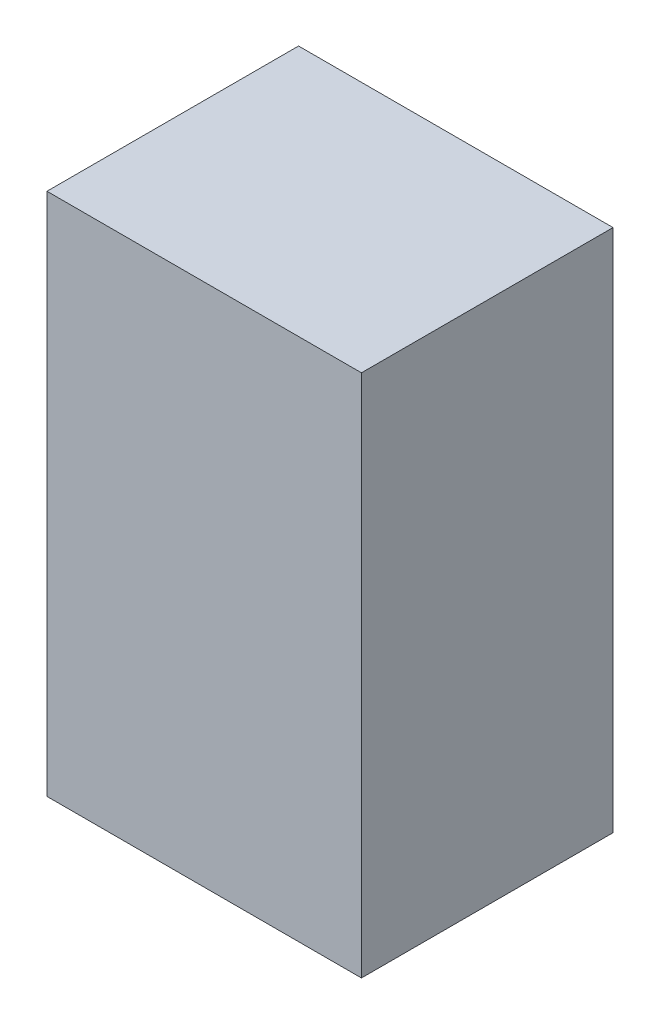
ISO-10303-21;
HEADER;
FILE_DESCRIPTION(('STEP AP214'),'2;1');
FILE_NAME('part.step','',(''),(''),'','','');
FILE_SCHEMA(('AUTOMOTIVE_DESIGN { 1 0 10303 214 1 1 1 1 }'));
ENDSEC;
DATA;
#1=APPLICATION_CONTEXT('core data for automotive mechanical design processes');
#2=APPLICATION_PROTOCOL_DEFINITION('international standard','automotive_design',2000,#1);
#3=PRODUCT_CONTEXT('',#1,'mechanical');
#4=PRODUCT('Part','Part','',(#3));
#5=PRODUCT_RELATED_PRODUCT_CATEGORY('part','',(#4));
#6=PRODUCT_DEFINITION_FORMATION('','',#4);
#7=PRODUCT_DEFINITION_CONTEXT('part definition',#1,'design');
#8=PRODUCT_DEFINITION('design','',#6,#7);
#9=PRODUCT_DEFINITION_SHAPE('','',#8);
#10=(LENGTH_UNIT() NAMED_UNIT(*) SI_UNIT(.MILLI.,.METRE.));
#11=(NAMED_UNIT(*) PLANE_ANGLE_UNIT() SI_UNIT($,.RADIAN.));
#12=(NAMED_UNIT(*) SI_UNIT($,.STERADIAN.) SOLID_ANGLE_UNIT());
#13=UNCERTAINTY_MEASURE_WITH_UNIT(LENGTH_MEASURE(1.E-05),#10,'distance_accuracy_value','');
#14=(GEOMETRIC_REPRESENTATION_CONTEXT(3) GLOBAL_UNCERTAINTY_ASSIGNED_CONTEXT((#13)) GLOBAL_UNIT_ASSIGNED_CONTEXT((#10,
#11,#12)) REPRESENTATION_CONTEXT('',''));
#15=CARTESIAN_POINT('',(0.,0.,0.));
#16=DIRECTION('',(0.,0.,1.));
#17=DIRECTION('',(1.,0.,0.));
#18=AXIS2_PLACEMENT_3D('',#15,#16,#17);
#19=CARTESIAN_POINT('',(0.,0.,4.8));
#20=DIRECTION('',(1.,0.,0.));
#21=DIRECTION('',(0.,0.,-1.));
#22=AXIS2_PLACEMENT_3D('',#19,#20,#21);
#23=PLANE('',#22);
#24=DIRECTION('',(0.,-1.,0.));
#25=VECTOR('',#24,1.);
#26=CARTESIAN_POINT('',(0.,0.,0.));
#27=LINE('',#26,#25);
#28=CARTESIAN_POINT('',(0.,10.,0.));
#29=VERTEX_POINT('',#28);
#30=CARTESIAN_POINT('',(0.,0.,0.));
#31=VERTEX_POINT('',#30);
#32=EDGE_CURVE('E102',#29,#31,#27,.T.);
#33=ORIENTED_EDGE('',*,*,#32,.T.);
#34=DIRECTION('',(0.,0.,-1.));
#35=VECTOR('',#34,1.);
#36=CARTESIAN_POINT('',(0.,0.,4.8));
#37=LINE('',#36,#35);
#38=CARTESIAN_POINT('',(0.,0.,4.8));
#39=VERTEX_POINT('',#38);
#40=EDGE_CURVE('E11',#39,#31,#37,.T.);
#41=ORIENTED_EDGE('',*,*,#40,.F.);
#42=DIRECTION('',(0.,-1.,0.));
#43=VECTOR('',#42,1.);
#44=CARTESIAN_POINT('',(0.,0.,4.8));
#45=LINE('',#44,#43);
#46=CARTESIAN_POINT('',(0.,10.,4.8));
#47=VERTEX_POINT('',#46);
#48=EDGE_CURVE('E90',#47,#39,#45,.T.);
#49=ORIENTED_EDGE('',*,*,#48,.F.);
#50=DIRECTION('',(0.,0.,-1.));
#51=VECTOR('',#50,1.);
#52=CARTESIAN_POINT('',(0.,10.,4.8));
#53=LINE('',#52,#51);
#54=EDGE_CURVE('E98',#47,#29,#53,.T.);
#55=ORIENTED_EDGE('',*,*,#54,.T.);
#56=EDGE_LOOP('',(#33,#41,#49,#55));
#57=FACE_BOUND('',#56,.T.);
#58=ADVANCED_FACE('F39',(#57),#23,.F.);
#59=CARTESIAN_POINT('',(0.,0.,4.8));
#60=DIRECTION('',(0.,1.,0.));
#61=DIRECTION('',(0.,0.,1.));
#62=AXIS2_PLACEMENT_3D('',#59,#60,#61);
#63=PLANE('',#62);
#64=DIRECTION('',(1.,0.,0.));
#65=VECTOR('',#64,1.);
#66=CARTESIAN_POINT('',(0.,0.,0.));
#67=LINE('',#66,#65);
#68=CARTESIAN_POINT('',(6.,0.,0.));
#69=VERTEX_POINT('',#68);
#70=EDGE_CURVE('E94',#31,#69,#67,.T.);
#71=ORIENTED_EDGE('',*,*,#70,.T.);
#72=DIRECTION('',(0.,0.,-1.));
#73=VECTOR('',#72,1.);
#74=CARTESIAN_POINT('',(6.,0.,4.8));
#75=LINE('',#74,#73);
#76=CARTESIAN_POINT('',(6.,0.,4.8));
#77=VERTEX_POINT('',#76);
#78=EDGE_CURVE('E47',#77,#69,#75,.T.);
#79=ORIENTED_EDGE('',*,*,#78,.F.);
#80=DIRECTION('',(1.,0.,0.));
#81=VECTOR('',#80,1.);
#82=CARTESIAN_POINT('',(0.,0.,4.8));
#83=LINE('',#82,#81);
#84=EDGE_CURVE('E85',#39,#77,#83,.T.);
#85=ORIENTED_EDGE('',*,*,#84,.F.);
#86=ORIENTED_EDGE('',*,*,#40,.T.);
#87=EDGE_LOOP('',(#71,#79,#85,#86));
#88=FACE_BOUND('',#87,.T.);
#89=ADVANCED_FACE('F93',(#88),#63,.F.);
#90=CARTESIAN_POINT('',(6.,0.,4.8));
#91=DIRECTION('',(-1.,0.,0.));
#92=DIRECTION('',(0.,0.,1.));
#93=AXIS2_PLACEMENT_3D('',#90,#91,#92);
#94=PLANE('',#93);
#95=DIRECTION('',(0.,1.,0.));
#96=VECTOR('',#95,1.);
#97=CARTESIAN_POINT('',(6.,0.,0.));
#98=LINE('',#97,#96);
#99=CARTESIAN_POINT('',(6.,10.,0.));
#100=VERTEX_POINT('',#99);
#101=EDGE_CURVE('E72',#69,#100,#98,.T.);
#102=ORIENTED_EDGE('',*,*,#101,.T.);
#103=DIRECTION('',(0.,0.,-1.));
#104=VECTOR('',#103,1.);
#105=CARTESIAN_POINT('',(6.,10.,4.8));
#106=LINE('',#105,#104);
#107=CARTESIAN_POINT('',(6.,10.,4.8));
#108=VERTEX_POINT('',#107);
#109=EDGE_CURVE('E95',#108,#100,#106,.T.);
#110=ORIENTED_EDGE('',*,*,#109,.F.);
#111=DIRECTION('',(0.,1.,0.));
#112=VECTOR('',#111,1.);
#113=CARTESIAN_POINT('',(6.,0.,4.8));
#114=LINE('',#113,#112);
#115=EDGE_CURVE('E88',#77,#108,#114,.T.);
#116=ORIENTED_EDGE('',*,*,#115,.F.);
#117=ORIENTED_EDGE('',*,*,#78,.T.);
#118=EDGE_LOOP('',(#102,#110,#116,#117));
#119=FACE_BOUND('',#118,.T.);
#120=ADVANCED_FACE('F96',(#119),#94,.F.);
#121=CARTESIAN_POINT('',(0.,10.,4.8));
#122=DIRECTION('',(0.,-1.,0.));
#123=DIRECTION('',(0.,0.,-1.));
#124=AXIS2_PLACEMENT_3D('',#121,#122,#123);
#125=PLANE('',#124);
#126=DIRECTION('',(-1.,0.,0.));
#127=VECTOR('',#126,1.);
#128=CARTESIAN_POINT('',(0.,10.,0.));
#129=LINE('',#128,#127);
#130=EDGE_CURVE('E78',#100,#29,#129,.T.);
#131=ORIENTED_EDGE('',*,*,#130,.T.);
#132=ORIENTED_EDGE('',*,*,#54,.F.);
#133=DIRECTION('',(-1.,0.,0.));
#134=VECTOR('',#133,1.);
#135=CARTESIAN_POINT('',(0.,10.,4.8));
#136=LINE('',#135,#134);
#137=EDGE_CURVE('E55',#108,#47,#136,.T.);
#138=ORIENTED_EDGE('',*,*,#137,.F.);
#139=ORIENTED_EDGE('',*,*,#109,.T.);
#140=EDGE_LOOP('',(#131,#132,#138,#139));
#141=FACE_BOUND('',#140,.T.);
#142=ADVANCED_FACE('F109',(#141),#125,.F.);
#143=CARTESIAN_POINT('',(0.,0.,4.8));
#144=DIRECTION('',(0.,0.,-1.));
#145=DIRECTION('',(-1.,0.,0.));
#146=AXIS2_PLACEMENT_3D('',#143,#144,#145);
#147=PLANE('',#146);
#148=ORIENTED_EDGE('',*,*,#48,.T.);
#149=ORIENTED_EDGE('',*,*,#84,.T.);
#150=ORIENTED_EDGE('',*,*,#115,.T.);
#151=ORIENTED_EDGE('',*,*,#137,.T.);
#152=EDGE_LOOP('',(#148,#149,#150,#151));
#153=FACE_BOUND('',#152,.T.);
#154=ADVANCED_FACE('F86',(#153),#147,.F.);
#155=CARTESIAN_POINT('',(0.,0.,0.));
#156=DIRECTION('',(0.,0.,-1.));
#157=DIRECTION('',(-1.,0.,0.));
#158=AXIS2_PLACEMENT_3D('',#155,#156,#157);
#159=PLANE('',#158);
#160=ORIENTED_EDGE('',*,*,#32,.F.);
#161=ORIENTED_EDGE('',*,*,#130,.F.);
#162=ORIENTED_EDGE('',*,*,#101,.F.);
#163=ORIENTED_EDGE('',*,*,#70,.F.);
#164=EDGE_LOOP('',(#160,#161,#162,#163));
#165=FACE_BOUND('',#164,.T.);
#166=ADVANCED_FACE('F112',(#165),#159,.T.);
#167=CLOSED_SHELL('',(#58,#89,#120,#142,#154,#166));
#168=MANIFOLD_SOLID_BREP('B2',#167);
#169=ADVANCED_BREP_SHAPE_REPRESENTATION('',(#18,#168),#14);
#170=SHAPE_DEFINITION_REPRESENTATION(#9,#169);
ENDSEC;
END-ISO-10303-21;
